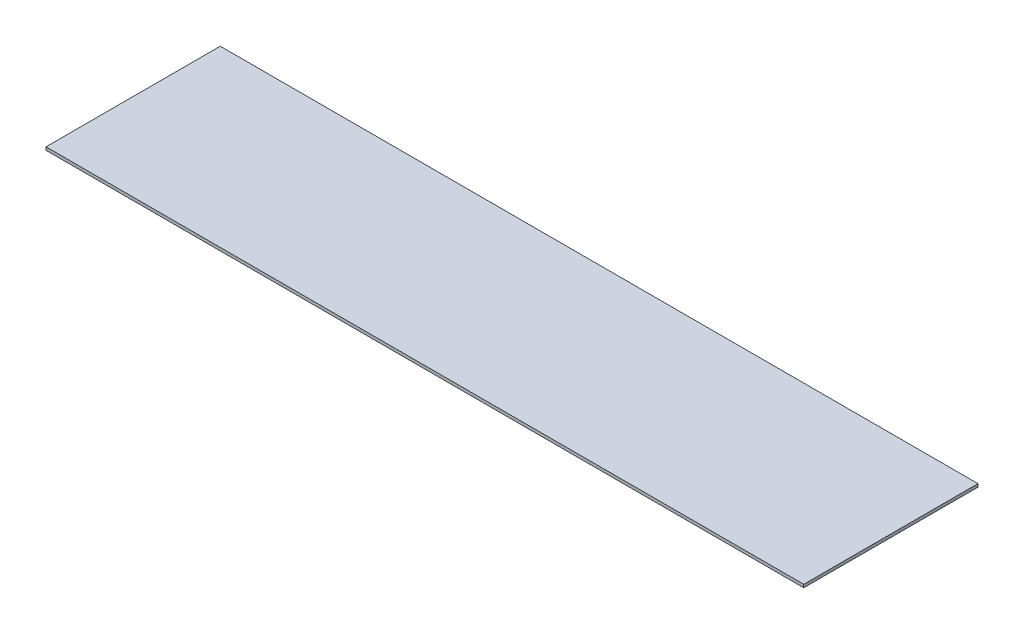
ISO-10303-21;
HEADER;
FILE_DESCRIPTION(('STEP AP214'),'2;1');
FILE_NAME('part.step','',(''),(''),'','','');
FILE_SCHEMA(('AUTOMOTIVE_DESIGN { 1 0 10303 214 1 1 1 1 }'));
ENDSEC;
DATA;
#1=APPLICATION_CONTEXT('core data for automotive mechanical design processes');
#2=APPLICATION_PROTOCOL_DEFINITION('international standard','automotive_design',2000,#1);
#3=PRODUCT_CONTEXT('',#1,'mechanical');
#4=PRODUCT('Part','Part','',(#3));
#5=PRODUCT_RELATED_PRODUCT_CATEGORY('part','',(#4));
#6=PRODUCT_DEFINITION_FORMATION('','',#4);
#7=PRODUCT_DEFINITION_CONTEXT('part definition',#1,'design');
#8=PRODUCT_DEFINITION('design','',#6,#7);
#9=PRODUCT_DEFINITION_SHAPE('','',#8);
#10=(LENGTH_UNIT() NAMED_UNIT(*) SI_UNIT(.MILLI.,.METRE.));
#11=(NAMED_UNIT(*) PLANE_ANGLE_UNIT() SI_UNIT($,.RADIAN.));
#12=(NAMED_UNIT(*) SI_UNIT($,.STERADIAN.) SOLID_ANGLE_UNIT());
#13=UNCERTAINTY_MEASURE_WITH_UNIT(LENGTH_MEASURE(1.E-05),#10,'distance_accuracy_value','');
#14=(GEOMETRIC_REPRESENTATION_CONTEXT(3) GLOBAL_UNCERTAINTY_ASSIGNED_CONTEXT((#13)) GLOBAL_UNIT_ASSIGNED_CONTEXT((#10,
#11,#12)) REPRESENTATION_CONTEXT('',''));
#15=CARTESIAN_POINT('',(0.,0.,0.));
#16=DIRECTION('',(0.,0.,1.));
#17=DIRECTION('',(1.,0.,0.));
#18=AXIS2_PLACEMENT_3D('',#15,#16,#17);
#19=CARTESIAN_POINT('',(-176.512287334594,2.,-119.092627599244));
#20=DIRECTION('',(1.,0.,0.));
#21=DIRECTION('',(0.,0.,-1.));
#22=AXIS2_PLACEMENT_3D('',#19,#20,#21);
#23=PLANE('',#22);
#24=DIRECTION('',(0.,0.,1.));
#25=VECTOR('',#24,1.);
#26=CARTESIAN_POINT('',(-176.512287334594,0.,-119.092627599244));
#27=LINE('',#26,#25);
#28=CARTESIAN_POINT('',(-176.512287334594,0.,-119.092627599244));
#29=VERTEX_POINT('',#28);
#30=CARTESIAN_POINT('',(-176.512287334594,0.,-4.09262759924385));
#31=VERTEX_POINT('',#30);
#32=EDGE_CURVE('E101',#29,#31,#27,.T.);
#33=ORIENTED_EDGE('',*,*,#32,.T.);
#34=DIRECTION('',(0.,-1.,0.));
#35=VECTOR('',#34,1.);
#36=CARTESIAN_POINT('',(-176.512287334594,2.,-4.09262759924385));
#37=LINE('',#36,#35);
#38=CARTESIAN_POINT('',(-176.512287334594,2.,-4.09262759924385));
#39=VERTEX_POINT('',#38);
#40=EDGE_CURVE('E11',#39,#31,#37,.T.);
#41=ORIENTED_EDGE('',*,*,#40,.F.);
#42=DIRECTION('',(0.,0.,1.));
#43=VECTOR('',#42,1.);
#44=CARTESIAN_POINT('',(-176.512287334594,2.,-119.092627599244));
#45=LINE('',#44,#43);
#46=CARTESIAN_POINT('',(-176.512287334594,2.,-119.092627599244));
#47=VERTEX_POINT('',#46);
#48=EDGE_CURVE('E89',#47,#39,#45,.T.);
#49=ORIENTED_EDGE('',*,*,#48,.F.);
#50=DIRECTION('',(0.,-1.,0.));
#51=VECTOR('',#50,1.);
#52=CARTESIAN_POINT('',(-176.512287334594,2.,-119.092627599244));
#53=LINE('',#52,#51);
#54=EDGE_CURVE('E97',#47,#29,#53,.T.);
#55=ORIENTED_EDGE('',*,*,#54,.T.);
#56=EDGE_LOOP('',(#33,#41,#49,#55));
#57=FACE_BOUND('',#56,.T.);
#58=ADVANCED_FACE('F38',(#57),#23,.F.);
#59=CARTESIAN_POINT('',(-176.512287334594,2.,-4.09262759924385));
#60=DIRECTION('',(0.,0.,-1.));
#61=DIRECTION('',(-1.,0.,0.));
#62=AXIS2_PLACEMENT_3D('',#59,#60,#61);
#63=PLANE('',#62);
#64=DIRECTION('',(1.,0.,0.));
#65=VECTOR('',#64,1.);
#66=CARTESIAN_POINT('',(-176.512287334594,0.,-4.09262759924385));
#67=LINE('',#66,#65);
#68=CARTESIAN_POINT('',(323.487712665406,0.,-4.09262759924385));
#69=VERTEX_POINT('',#68);
#70=EDGE_CURVE('E93',#31,#69,#67,.T.);
#71=ORIENTED_EDGE('',*,*,#70,.T.);
#72=DIRECTION('',(0.,-1.,0.));
#73=VECTOR('',#72,1.);
#74=CARTESIAN_POINT('',(323.487712665406,2.,-4.09262759924385));
#75=LINE('',#74,#73);
#76=CARTESIAN_POINT('',(323.487712665406,2.,-4.09262759924385));
#77=VERTEX_POINT('',#76);
#78=EDGE_CURVE('E46',#77,#69,#75,.T.);
#79=ORIENTED_EDGE('',*,*,#78,.F.);
#80=DIRECTION('',(1.,0.,0.));
#81=VECTOR('',#80,1.);
#82=CARTESIAN_POINT('',(-176.512287334594,2.,-4.09262759924385));
#83=LINE('',#82,#81);
#84=EDGE_CURVE('E84',#39,#77,#83,.T.);
#85=ORIENTED_EDGE('',*,*,#84,.F.);
#86=ORIENTED_EDGE('',*,*,#40,.T.);
#87=EDGE_LOOP('',(#71,#79,#85,#86));
#88=FACE_BOUND('',#87,.T.);
#89=ADVANCED_FACE('F92',(#88),#63,.F.);
#90=CARTESIAN_POINT('',(323.487712665406,2.,-119.092627599244));
#91=DIRECTION('',(-1.,0.,0.));
#92=DIRECTION('',(0.,0.,1.));
#93=AXIS2_PLACEMENT_3D('',#90,#91,#92);
#94=PLANE('',#93);
#95=DIRECTION('',(0.,0.,-1.));
#96=VECTOR('',#95,1.);
#97=CARTESIAN_POINT('',(323.487712665406,0.,-119.092627599244));
#98=LINE('',#97,#96);
#99=CARTESIAN_POINT('',(323.487712665406,0.,-119.092627599244));
#100=VERTEX_POINT('',#99);
#101=EDGE_CURVE('E71',#69,#100,#98,.T.);
#102=ORIENTED_EDGE('',*,*,#101,.T.);
#103=DIRECTION('',(0.,-1.,0.));
#104=VECTOR('',#103,1.);
#105=CARTESIAN_POINT('',(323.487712665406,2.,-119.092627599244));
#106=LINE('',#105,#104);
#107=CARTESIAN_POINT('',(323.487712665406,2.,-119.092627599244));
#108=VERTEX_POINT('',#107);
#109=EDGE_CURVE('E94',#108,#100,#106,.T.);
#110=ORIENTED_EDGE('',*,*,#109,.F.);
#111=DIRECTION('',(0.,0.,-1.));
#112=VECTOR('',#111,1.);
#113=CARTESIAN_POINT('',(323.487712665406,2.,-119.092627599244));
#114=LINE('',#113,#112);
#115=EDGE_CURVE('E87',#77,#108,#114,.T.);
#116=ORIENTED_EDGE('',*,*,#115,.F.);
#117=ORIENTED_EDGE('',*,*,#78,.T.);
#118=EDGE_LOOP('',(#102,#110,#116,#117));
#119=FACE_BOUND('',#118,.T.);
#120=ADVANCED_FACE('F95',(#119),#94,.F.);
#121=CARTESIAN_POINT('',(-176.512287334594,2.,-119.092627599244));
#122=DIRECTION('',(0.,0.,1.));
#123=DIRECTION('',(1.,0.,0.));
#124=AXIS2_PLACEMENT_3D('',#121,#122,#123);
#125=PLANE('',#124);
#126=DIRECTION('',(-1.,0.,0.));
#127=VECTOR('',#126,1.);
#128=CARTESIAN_POINT('',(-176.512287334594,0.,-119.092627599244));
#129=LINE('',#128,#127);
#130=EDGE_CURVE('E77',#100,#29,#129,.T.);
#131=ORIENTED_EDGE('',*,*,#130,.T.);
#132=ORIENTED_EDGE('',*,*,#54,.F.);
#133=DIRECTION('',(-1.,0.,0.));
#134=VECTOR('',#133,1.);
#135=CARTESIAN_POINT('',(-176.512287334594,2.,-119.092627599244));
#136=LINE('',#135,#134);
#137=EDGE_CURVE('E54',#108,#47,#136,.T.);
#138=ORIENTED_EDGE('',*,*,#137,.F.);
#139=ORIENTED_EDGE('',*,*,#109,.T.);
#140=EDGE_LOOP('',(#131,#132,#138,#139));
#141=FACE_BOUND('',#140,.T.);
#142=ADVANCED_FACE('F108',(#141),#125,.F.);
#143=CARTESIAN_POINT('',(0.,2.,0.));
#144=DIRECTION('',(0.,1.,0.));
#145=DIRECTION('',(0.,0.,1.));
#146=AXIS2_PLACEMENT_3D('',#143,#144,#145);
#147=PLANE('',#146);
#148=ORIENTED_EDGE('',*,*,#48,.T.);
#149=ORIENTED_EDGE('',*,*,#84,.T.);
#150=ORIENTED_EDGE('',*,*,#115,.T.);
#151=ORIENTED_EDGE('',*,*,#137,.T.);
#152=EDGE_LOOP('',(#148,#149,#150,#151));
#153=FACE_BOUND('',#152,.T.);
#154=ADVANCED_FACE('F85',(#153),#147,.T.);
#155=CARTESIAN_POINT('',(0.,0.,0.));
#156=DIRECTION('',(0.,1.,0.));
#157=DIRECTION('',(0.,0.,1.));
#158=AXIS2_PLACEMENT_3D('',#155,#156,#157);
#159=PLANE('',#158);
#160=ORIENTED_EDGE('',*,*,#32,.F.);
#161=ORIENTED_EDGE('',*,*,#130,.F.);
#162=ORIENTED_EDGE('',*,*,#101,.F.);
#163=ORIENTED_EDGE('',*,*,#70,.F.);
#164=EDGE_LOOP('',(#160,#161,#162,#163));
#165=FACE_BOUND('',#164,.T.);
#166=ADVANCED_FACE('F111',(#165),#159,.F.);
#167=CLOSED_SHELL('',(#58,#89,#120,#142,#154,#166));
#168=MANIFOLD_SOLID_BREP('B2',#167);
#169=ADVANCED_BREP_SHAPE_REPRESENTATION('',(#18,#168),#14);
#170=SHAPE_DEFINITION_REPRESENTATION(#9,#169);
ENDSEC;
END-ISO-10303-21;
